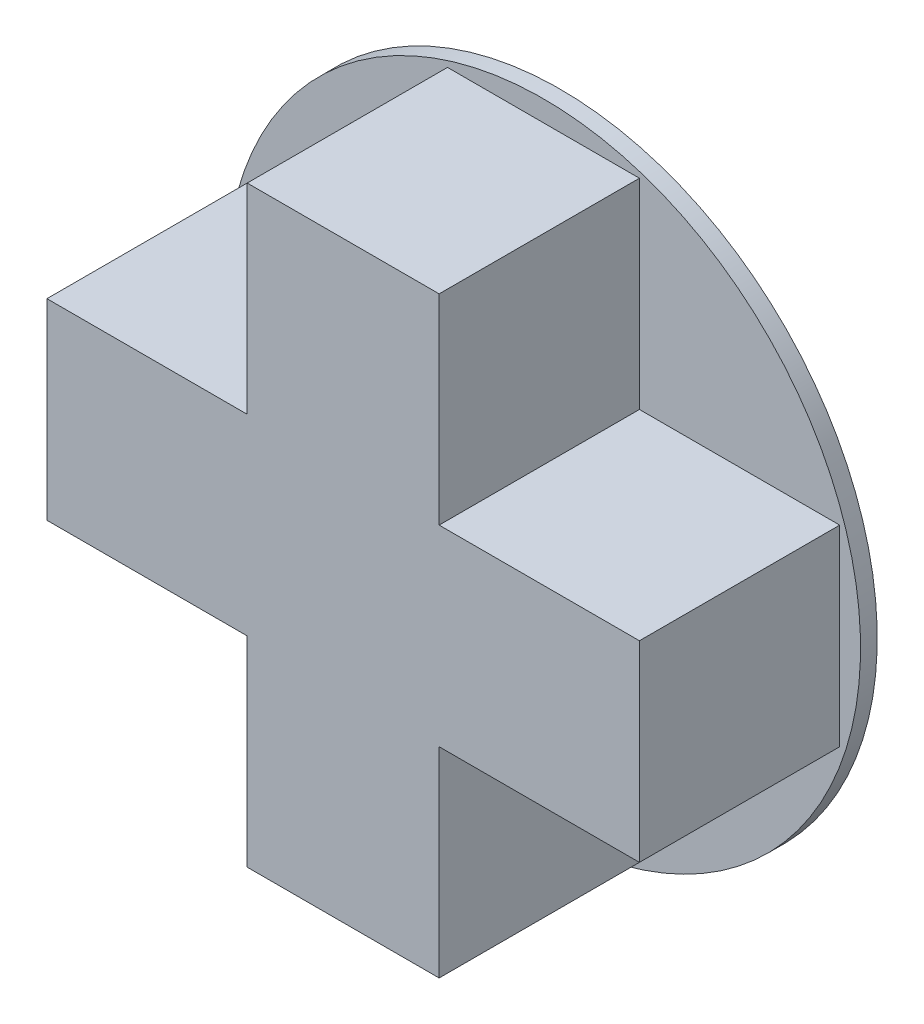
ISO-10303-21;
HEADER;
FILE_DESCRIPTION(('STEP AP214'),'2;1');
FILE_NAME('part.step','',(''),(''),'','','');
FILE_SCHEMA(('AUTOMOTIVE_DESIGN { 1 0 10303 214 1 1 1 1 }'));
ENDSEC;
DATA;
#1=APPLICATION_CONTEXT('core data for automotive mechanical design processes');
#2=APPLICATION_PROTOCOL_DEFINITION('international standard','automotive_design',2000,#1);
#3=PRODUCT_CONTEXT('',#1,'mechanical');
#4=PRODUCT('Part','Part','',(#3));
#5=PRODUCT_RELATED_PRODUCT_CATEGORY('part','',(#4));
#6=PRODUCT_DEFINITION_FORMATION('','',#4);
#7=PRODUCT_DEFINITION_CONTEXT('part definition',#1,'design');
#8=PRODUCT_DEFINITION('design','',#6,#7);
#9=PRODUCT_DEFINITION_SHAPE('','',#8);
#10=(LENGTH_UNIT() NAMED_UNIT(*) SI_UNIT(.MILLI.,.METRE.));
#11=(NAMED_UNIT(*) PLANE_ANGLE_UNIT() SI_UNIT($,.RADIAN.));
#12=(NAMED_UNIT(*) SI_UNIT($,.STERADIAN.) SOLID_ANGLE_UNIT());
#13=UNCERTAINTY_MEASURE_WITH_UNIT(LENGTH_MEASURE(1.E-05),#10,'distance_accuracy_value','');
#14=(GEOMETRIC_REPRESENTATION_CONTEXT(3) GLOBAL_UNCERTAINTY_ASSIGNED_CONTEXT((#13)) GLOBAL_UNIT_ASSIGNED_CONTEXT((#10,
#11,#12)) REPRESENTATION_CONTEXT('',''));
#15=CARTESIAN_POINT('',(0.,0.,0.));
#16=DIRECTION('',(0.,0.,1.));
#17=DIRECTION('',(1.,0.,0.));
#18=AXIS2_PLACEMENT_3D('',#15,#16,#17);
#19=CARTESIAN_POINT('',(2.875,2.875,6.));
#20=DIRECTION('',(-1.,0.,0.));
#21=DIRECTION('',(0.,0.,1.));
#22=AXIS2_PLACEMENT_3D('',#19,#20,#21);
#23=PLANE('',#22);
#24=DIRECTION('',(0.,1.,0.));
#25=VECTOR('',#24,1.);
#26=CARTESIAN_POINT('',(2.875,2.875,0.));
#27=LINE('',#26,#25);
#28=CARTESIAN_POINT('',(2.875,2.875,0.));
#29=VERTEX_POINT('',#28);
#30=CARTESIAN_POINT('',(2.875,8.875,0.));
#31=VERTEX_POINT('',#30);
#32=EDGE_CURVE('E123',#29,#31,#27,.T.);
#33=ORIENTED_EDGE('',*,*,#32,.T.);
#34=DIRECTION('',(0.,0.,-1.));
#35=VECTOR('',#34,1.);
#36=CARTESIAN_POINT('',(2.875,8.875,6.));
#37=LINE('',#36,#35);
#38=CARTESIAN_POINT('',(2.875,8.875,6.));
#39=VERTEX_POINT('',#38);
#40=EDGE_CURVE('E11',#39,#31,#37,.T.);
#41=ORIENTED_EDGE('',*,*,#40,.F.);
#42=DIRECTION('',(0.,1.,0.));
#43=VECTOR('',#42,1.);
#44=CARTESIAN_POINT('',(2.875,2.875,6.));
#45=LINE('',#44,#43);
#46=CARTESIAN_POINT('',(2.875,2.875,6.));
#47=VERTEX_POINT('',#46);
#48=EDGE_CURVE('E127',#47,#39,#45,.T.);
#49=ORIENTED_EDGE('',*,*,#48,.F.);
#50=DIRECTION('',(0.,0.,-1.));
#51=VECTOR('',#50,1.);
#52=CARTESIAN_POINT('',(2.875,2.875,6.));
#53=LINE('',#52,#51);
#54=EDGE_CURVE('E140',#47,#29,#53,.T.);
#55=ORIENTED_EDGE('',*,*,#54,.T.);
#56=EDGE_LOOP('',(#33,#41,#49,#55));
#57=FACE_BOUND('',#56,.T.);
#58=ADVANCED_FACE('F33',(#57),#23,.F.);
#59=CARTESIAN_POINT('',(-2.875,8.875,6.));
#60=DIRECTION('',(0.,-1.,0.));
#61=DIRECTION('',(0.,0.,-1.));
#62=AXIS2_PLACEMENT_3D('',#59,#60,#61);
#63=PLANE('',#62);
#64=DIRECTION('',(-1.,0.,0.));
#65=VECTOR('',#64,1.);
#66=CARTESIAN_POINT('',(-2.875,8.875,0.));
#67=LINE('',#66,#65);
#68=CARTESIAN_POINT('',(-2.875,8.875,0.));
#69=VERTEX_POINT('',#68);
#70=EDGE_CURVE('E178',#31,#69,#67,.T.);
#71=ORIENTED_EDGE('',*,*,#70,.T.);
#72=DIRECTION('',(0.,0.,-1.));
#73=VECTOR('',#72,1.);
#74=CARTESIAN_POINT('',(-2.875,8.875,6.));
#75=LINE('',#74,#73);
#76=CARTESIAN_POINT('',(-2.875,8.875,6.));
#77=VERTEX_POINT('',#76);
#78=EDGE_CURVE('E41',#77,#69,#75,.T.);
#79=ORIENTED_EDGE('',*,*,#78,.F.);
#80=DIRECTION('',(-1.,0.,0.));
#81=VECTOR('',#80,1.);
#82=CARTESIAN_POINT('',(-2.875,8.875,6.));
#83=LINE('',#82,#81);
#84=EDGE_CURVE('E177',#39,#77,#83,.T.);
#85=ORIENTED_EDGE('',*,*,#84,.F.);
#86=ORIENTED_EDGE('',*,*,#40,.T.);
#87=EDGE_LOOP('',(#71,#79,#85,#86));
#88=FACE_BOUND('',#87,.T.);
#89=ADVANCED_FACE('F176',(#88),#63,.F.);
#90=CARTESIAN_POINT('',(-2.875,2.875,6.));
#91=DIRECTION('',(1.,0.,0.));
#92=DIRECTION('',(0.,0.,-1.));
#93=AXIS2_PLACEMENT_3D('',#90,#91,#92);
#94=PLANE('',#93);
#95=DIRECTION('',(0.,-1.,0.));
#96=VECTOR('',#95,1.);
#97=CARTESIAN_POINT('',(-2.875,2.875,0.));
#98=LINE('',#97,#96);
#99=CARTESIAN_POINT('',(-2.875,2.875,0.));
#100=VERTEX_POINT('',#99);
#101=EDGE_CURVE('E172',#69,#100,#98,.T.);
#102=ORIENTED_EDGE('',*,*,#101,.T.);
#103=DIRECTION('',(0.,0.,-1.));
#104=VECTOR('',#103,1.);
#105=CARTESIAN_POINT('',(-2.875,2.875,6.));
#106=LINE('',#105,#104);
#107=CARTESIAN_POINT('',(-2.875,2.875,6.));
#108=VERTEX_POINT('',#107);
#109=EDGE_CURVE('E163',#108,#100,#106,.T.);
#110=ORIENTED_EDGE('',*,*,#109,.F.);
#111=DIRECTION('',(0.,-1.,0.));
#112=VECTOR('',#111,1.);
#113=CARTESIAN_POINT('',(-2.875,2.875,6.));
#114=LINE('',#113,#112);
#115=EDGE_CURVE('E173',#77,#108,#114,.T.);
#116=ORIENTED_EDGE('',*,*,#115,.F.);
#117=ORIENTED_EDGE('',*,*,#78,.T.);
#118=EDGE_LOOP('',(#102,#110,#116,#117));
#119=FACE_BOUND('',#118,.T.);
#120=ADVANCED_FACE('F170',(#119),#94,.F.);
#121=CARTESIAN_POINT('',(-8.875,2.875,6.));
#122=DIRECTION('',(0.,-1.,0.));
#123=DIRECTION('',(1.,0.,0.));
#124=AXIS2_PLACEMENT_3D('',#121,#122,#123);
#125=PLANE('',#124);
#126=DIRECTION('',(-1.,0.,0.));
#127=VECTOR('',#126,1.);
#128=CARTESIAN_POINT('',(-8.875,2.875,0.));
#129=LINE('',#128,#127);
#130=CARTESIAN_POINT('',(-8.875,2.875,0.));
#131=VERTEX_POINT('',#130);
#132=EDGE_CURVE('E181',#100,#131,#129,.T.);
#133=ORIENTED_EDGE('',*,*,#132,.T.);
#134=DIRECTION('',(0.,0.,-1.));
#135=VECTOR('',#134,1.);
#136=CARTESIAN_POINT('',(-8.875,2.875,6.));
#137=LINE('',#136,#135);
#138=CARTESIAN_POINT('',(-8.875,2.875,6.));
#139=VERTEX_POINT('',#138);
#140=EDGE_CURVE('E160',#139,#131,#137,.T.);
#141=ORIENTED_EDGE('',*,*,#140,.F.);
#142=DIRECTION('',(-1.,0.,0.));
#143=VECTOR('',#142,1.);
#144=CARTESIAN_POINT('',(-8.875,2.875,6.));
#145=LINE('',#144,#143);
#146=EDGE_CURVE('E236',#108,#139,#145,.T.);
#147=ORIENTED_EDGE('',*,*,#146,.F.);
#148=ORIENTED_EDGE('',*,*,#109,.T.);
#149=EDGE_LOOP('',(#133,#141,#147,#148));
#150=FACE_BOUND('',#149,.T.);
#151=ADVANCED_FACE('F235',(#150),#125,.F.);
#152=CARTESIAN_POINT('',(-8.875,-2.875,6.));
#153=DIRECTION('',(1.,0.,0.));
#154=DIRECTION('',(0.,0.,-1.));
#155=AXIS2_PLACEMENT_3D('',#152,#153,#154);
#156=PLANE('',#155);
#157=DIRECTION('',(0.,-1.,0.));
#158=VECTOR('',#157,1.);
#159=CARTESIAN_POINT('',(-8.875,-2.875,0.));
#160=LINE('',#159,#158);
#161=CARTESIAN_POINT('',(-8.875,-2.875,0.));
#162=VERTEX_POINT('',#161);
#163=EDGE_CURVE('E189',#131,#162,#160,.T.);
#164=ORIENTED_EDGE('',*,*,#163,.T.);
#165=DIRECTION('',(0.,0.,-1.));
#166=VECTOR('',#165,1.);
#167=CARTESIAN_POINT('',(-8.875,-2.875,6.));
#168=LINE('',#167,#166);
#169=CARTESIAN_POINT('',(-8.875,-2.875,6.));
#170=VERTEX_POINT('',#169);
#171=EDGE_CURVE('E157',#170,#162,#168,.T.);
#172=ORIENTED_EDGE('',*,*,#171,.F.);
#173=DIRECTION('',(0.,-1.,0.));
#174=VECTOR('',#173,1.);
#175=CARTESIAN_POINT('',(-8.875,-2.875,6.));
#176=LINE('',#175,#174);
#177=EDGE_CURVE('E232',#139,#170,#176,.T.);
#178=ORIENTED_EDGE('',*,*,#177,.F.);
#179=ORIENTED_EDGE('',*,*,#140,.T.);
#180=EDGE_LOOP('',(#164,#172,#178,#179));
#181=FACE_BOUND('',#180,.T.);
#182=ADVANCED_FACE('F229',(#181),#156,.F.);
#183=CARTESIAN_POINT('',(-8.875,-2.875,6.));
#184=DIRECTION('',(0.,1.,0.));
#185=DIRECTION('',(0.,0.,1.));
#186=AXIS2_PLACEMENT_3D('',#183,#184,#185);
#187=PLANE('',#186);
#188=DIRECTION('',(1.,0.,0.));
#189=VECTOR('',#188,1.);
#190=CARTESIAN_POINT('',(-8.875,-2.875,0.));
#191=LINE('',#190,#189);
#192=CARTESIAN_POINT('',(-2.875,-2.875,0.));
#193=VERTEX_POINT('',#192);
#194=EDGE_CURVE('E192',#162,#193,#191,.T.);
#195=ORIENTED_EDGE('',*,*,#194,.T.);
#196=DIRECTION('',(0.,0.,-1.));
#197=VECTOR('',#196,1.);
#198=CARTESIAN_POINT('',(-2.875,-2.875,6.));
#199=LINE('',#198,#197);
#200=CARTESIAN_POINT('',(-2.875,-2.875,6.));
#201=VERTEX_POINT('',#200);
#202=EDGE_CURVE('E154',#201,#193,#199,.T.);
#203=ORIENTED_EDGE('',*,*,#202,.F.);
#204=DIRECTION('',(1.,0.,0.));
#205=VECTOR('',#204,1.);
#206=CARTESIAN_POINT('',(-8.875,-2.875,6.));
#207=LINE('',#206,#205);
#208=EDGE_CURVE('E226',#170,#201,#207,.T.);
#209=ORIENTED_EDGE('',*,*,#208,.F.);
#210=ORIENTED_EDGE('',*,*,#171,.T.);
#211=EDGE_LOOP('',(#195,#203,#209,#210));
#212=FACE_BOUND('',#211,.T.);
#213=ADVANCED_FACE('F225',(#212),#187,.F.);
#214=CARTESIAN_POINT('',(-2.875,-8.875,6.));
#215=DIRECTION('',(1.,0.,0.));
#216=DIRECTION('',(0.,0.,-1.));
#217=AXIS2_PLACEMENT_3D('',#214,#215,#216);
#218=PLANE('',#217);
#219=DIRECTION('',(0.,-1.,0.));
#220=VECTOR('',#219,1.);
#221=CARTESIAN_POINT('',(-2.875,-8.875,0.));
#222=LINE('',#221,#220);
#223=CARTESIAN_POINT('',(-2.875,-8.875,0.));
#224=VERTEX_POINT('',#223);
#225=EDGE_CURVE('E195',#193,#224,#222,.T.);
#226=ORIENTED_EDGE('',*,*,#225,.T.);
#227=DIRECTION('',(0.,0.,-1.));
#228=VECTOR('',#227,1.);
#229=CARTESIAN_POINT('',(-2.875,-8.875,6.));
#230=LINE('',#229,#228);
#231=CARTESIAN_POINT('',(-2.875,-8.875,6.));
#232=VERTEX_POINT('',#231);
#233=EDGE_CURVE('E151',#232,#224,#230,.T.);
#234=ORIENTED_EDGE('',*,*,#233,.F.);
#235=DIRECTION('',(0.,-1.,0.));
#236=VECTOR('',#235,1.);
#237=CARTESIAN_POINT('',(-2.875,-8.875,6.));
#238=LINE('',#237,#236);
#239=EDGE_CURVE('E222',#201,#232,#238,.T.);
#240=ORIENTED_EDGE('',*,*,#239,.F.);
#241=ORIENTED_EDGE('',*,*,#202,.T.);
#242=EDGE_LOOP('',(#226,#234,#240,#241));
#243=FACE_BOUND('',#242,.T.);
#244=ADVANCED_FACE('F219',(#243),#218,.F.);
#245=CARTESIAN_POINT('',(-2.875,-8.875,6.));
#246=DIRECTION('',(0.,1.,0.));
#247=DIRECTION('',(0.,0.,1.));
#248=AXIS2_PLACEMENT_3D('',#245,#246,#247);
#249=PLANE('',#248);
#250=DIRECTION('',(1.,0.,0.));
#251=VECTOR('',#250,1.);
#252=CARTESIAN_POINT('',(-2.875,-8.875,0.));
#253=LINE('',#252,#251);
#254=CARTESIAN_POINT('',(2.875,-8.875,0.));
#255=VERTEX_POINT('',#254);
#256=EDGE_CURVE('E198',#224,#255,#253,.T.);
#257=ORIENTED_EDGE('',*,*,#256,.T.);
#258=DIRECTION('',(0.,0.,-1.));
#259=VECTOR('',#258,1.);
#260=CARTESIAN_POINT('',(2.875,-8.875,6.));
#261=LINE('',#260,#259);
#262=CARTESIAN_POINT('',(2.875,-8.875,6.));
#263=VERTEX_POINT('',#262);
#264=EDGE_CURVE('E148',#263,#255,#261,.T.);
#265=ORIENTED_EDGE('',*,*,#264,.F.);
#266=DIRECTION('',(1.,0.,0.));
#267=VECTOR('',#266,1.);
#268=CARTESIAN_POINT('',(-2.875,-8.875,6.));
#269=LINE('',#268,#267);
#270=EDGE_CURVE('E216',#232,#263,#269,.T.);
#271=ORIENTED_EDGE('',*,*,#270,.F.);
#272=ORIENTED_EDGE('',*,*,#233,.T.);
#273=EDGE_LOOP('',(#257,#265,#271,#272));
#274=FACE_BOUND('',#273,.T.);
#275=ADVANCED_FACE('F215',(#274),#249,.F.);
#276=CARTESIAN_POINT('',(2.875,-8.875,6.));
#277=DIRECTION('',(-1.,0.,0.));
#278=DIRECTION('',(0.,-1.,0.));
#279=AXIS2_PLACEMENT_3D('',#276,#277,#278);
#280=PLANE('',#279);
#281=DIRECTION('',(0.,1.,0.));
#282=VECTOR('',#281,1.);
#283=CARTESIAN_POINT('',(2.875,-8.875,0.));
#284=LINE('',#283,#282);
#285=CARTESIAN_POINT('',(2.875,-2.875,0.));
#286=VERTEX_POINT('',#285);
#287=EDGE_CURVE('E201',#255,#286,#284,.T.);
#288=ORIENTED_EDGE('',*,*,#287,.T.);
#289=DIRECTION('',(0.,0.,-1.));
#290=VECTOR('',#289,1.);
#291=CARTESIAN_POINT('',(2.875,-2.875,6.));
#292=LINE('',#291,#290);
#293=CARTESIAN_POINT('',(2.875,-2.875,6.));
#294=VERTEX_POINT('',#293);
#295=EDGE_CURVE('E142',#294,#286,#292,.T.);
#296=ORIENTED_EDGE('',*,*,#295,.F.);
#297=DIRECTION('',(0.,1.,0.));
#298=VECTOR('',#297,1.);
#299=CARTESIAN_POINT('',(2.875,-8.875,6.));
#300=LINE('',#299,#298);
#301=EDGE_CURVE('E212',#263,#294,#300,.T.);
#302=ORIENTED_EDGE('',*,*,#301,.F.);
#303=ORIENTED_EDGE('',*,*,#264,.T.);
#304=EDGE_LOOP('',(#288,#296,#302,#303));
#305=FACE_BOUND('',#304,.T.);
#306=ADVANCED_FACE('F209',(#305),#280,.F.);
#307=CARTESIAN_POINT('',(2.875,-2.875,6.));
#308=DIRECTION('',(0.,1.,0.));
#309=DIRECTION('',(0.,0.,1.));
#310=AXIS2_PLACEMENT_3D('',#307,#308,#309);
#311=PLANE('',#310);
#312=DIRECTION('',(1.,0.,0.));
#313=VECTOR('',#312,1.);
#314=CARTESIAN_POINT('',(2.875,-2.875,0.));
#315=LINE('',#314,#313);
#316=CARTESIAN_POINT('',(8.875,-2.875,0.));
#317=VERTEX_POINT('',#316);
#318=EDGE_CURVE('E137',#286,#317,#315,.T.);
#319=ORIENTED_EDGE('',*,*,#318,.T.);
#320=DIRECTION('',(0.,0.,-1.));
#321=VECTOR('',#320,1.);
#322=CARTESIAN_POINT('',(8.875,-2.875,6.));
#323=LINE('',#322,#321);
#324=CARTESIAN_POINT('',(8.875,-2.875,6.));
#325=VERTEX_POINT('',#324);
#326=EDGE_CURVE('E136',#325,#317,#323,.T.);
#327=ORIENTED_EDGE('',*,*,#326,.F.);
#328=DIRECTION('',(1.,0.,0.));
#329=VECTOR('',#328,1.);
#330=CARTESIAN_POINT('',(2.875,-2.875,6.));
#331=LINE('',#330,#329);
#332=EDGE_CURVE('E246',#294,#325,#331,.T.);
#333=ORIENTED_EDGE('',*,*,#332,.F.);
#334=ORIENTED_EDGE('',*,*,#295,.T.);
#335=EDGE_LOOP('',(#319,#327,#333,#334));
#336=FACE_BOUND('',#335,.T.);
#337=ADVANCED_FACE('F205',(#336),#311,.F.);
#338=CARTESIAN_POINT('',(8.875,-2.875,6.));
#339=DIRECTION('',(-1.,0.,0.));
#340=DIRECTION('',(0.,0.,1.));
#341=AXIS2_PLACEMENT_3D('',#338,#339,#340);
#342=PLANE('',#341);
#343=DIRECTION('',(0.,1.,0.));
#344=VECTOR('',#343,1.);
#345=CARTESIAN_POINT('',(8.875,-2.875,0.));
#346=LINE('',#345,#344);
#347=CARTESIAN_POINT('',(8.875,2.875,0.));
#348=VERTEX_POINT('',#347);
#349=EDGE_CURVE('E120',#317,#348,#346,.T.);
#350=ORIENTED_EDGE('',*,*,#349,.T.);
#351=DIRECTION('',(0.,0.,-1.));
#352=VECTOR('',#351,1.);
#353=CARTESIAN_POINT('',(8.875,2.875,6.));
#354=LINE('',#353,#352);
#355=CARTESIAN_POINT('',(8.875,2.875,6.));
#356=VERTEX_POINT('',#355);
#357=EDGE_CURVE('E134',#356,#348,#354,.T.);
#358=ORIENTED_EDGE('',*,*,#357,.F.);
#359=DIRECTION('',(0.,1.,0.));
#360=VECTOR('',#359,1.);
#361=CARTESIAN_POINT('',(8.875,-2.875,6.));
#362=LINE('',#361,#360);
#363=EDGE_CURVE('E248',#325,#356,#362,.T.);
#364=ORIENTED_EDGE('',*,*,#363,.F.);
#365=ORIENTED_EDGE('',*,*,#326,.T.);
#366=EDGE_LOOP('',(#350,#358,#364,#365));
#367=FACE_BOUND('',#366,.T.);
#368=ADVANCED_FACE('F132',(#367),#342,.F.);
#369=CARTESIAN_POINT('',(2.875,2.875,6.));
#370=DIRECTION('',(0.,-1.,0.));
#371=DIRECTION('',(0.,0.,-1.));
#372=AXIS2_PLACEMENT_3D('',#369,#370,#371);
#373=PLANE('',#372);
#374=DIRECTION('',(-1.,0.,0.));
#375=VECTOR('',#374,1.);
#376=CARTESIAN_POINT('',(2.875,2.875,0.));
#377=LINE('',#376,#375);
#378=EDGE_CURVE('E117',#348,#29,#377,.T.);
#379=ORIENTED_EDGE('',*,*,#378,.T.);
#380=ORIENTED_EDGE('',*,*,#54,.F.);
#381=DIRECTION('',(-1.,0.,0.));
#382=VECTOR('',#381,1.);
#383=CARTESIAN_POINT('',(2.875,2.875,6.));
#384=LINE('',#383,#382);
#385=EDGE_CURVE('E48',#356,#47,#384,.T.);
#386=ORIENTED_EDGE('',*,*,#385,.F.);
#387=ORIENTED_EDGE('',*,*,#357,.T.);
#388=EDGE_LOOP('',(#379,#380,#386,#387));
#389=FACE_BOUND('',#388,.T.);
#390=ADVANCED_FACE('F139',(#389),#373,.F.);
#391=CARTESIAN_POINT('',(0.,0.,6.));
#392=DIRECTION('',(0.,0.,-1.));
#393=DIRECTION('',(-1.,0.,0.));
#394=AXIS2_PLACEMENT_3D('',#391,#392,#393);
#395=PLANE('',#394);
#396=ORIENTED_EDGE('',*,*,#48,.T.);
#397=ORIENTED_EDGE('',*,*,#84,.T.);
#398=ORIENTED_EDGE('',*,*,#115,.T.);
#399=ORIENTED_EDGE('',*,*,#146,.T.);
#400=ORIENTED_EDGE('',*,*,#177,.T.);
#401=ORIENTED_EDGE('',*,*,#208,.T.);
#402=ORIENTED_EDGE('',*,*,#239,.T.);
#403=ORIENTED_EDGE('',*,*,#270,.T.);
#404=ORIENTED_EDGE('',*,*,#301,.T.);
#405=ORIENTED_EDGE('',*,*,#332,.T.);
#406=ORIENTED_EDGE('',*,*,#363,.T.);
#407=ORIENTED_EDGE('',*,*,#385,.T.);
#408=EDGE_LOOP('',(#396,#397,#398,#399,#400,#401,#402,#403,#404,#405,#406,#407));
#409=FACE_BOUND('',#408,.T.);
#410=ADVANCED_FACE('F249',(#409),#395,.F.);
#411=CARTESIAN_POINT('',(0.,0.,0.));
#412=DIRECTION('',(0.,0.,-1.));
#413=DIRECTION('',(-1.,0.,0.));
#414=AXIS2_PLACEMENT_3D('',#411,#412,#413);
#415=PLANE('',#414);
#416=CARTESIAN_POINT('',(0.,0.,0.));
#417=DIRECTION('',(0.,0.,-1.));
#418=DIRECTION('',(-1.,0.,0.));
#419=AXIS2_PLACEMENT_3D('',#416,#417,#418);
#420=CIRCLE('',#419,9.5);
#421=CARTESIAN_POINT('',(-9.5,0.,0.));
#422=VERTEX_POINT('',#421);
#423=EDGE_CURVE('E269',#422,#422,#420,.T.);
#424=ORIENTED_EDGE('',*,*,#423,.F.);
#425=EDGE_LOOP('',(#424));
#426=FACE_BOUND('',#425,.T.);
#427=ORIENTED_EDGE('',*,*,#70,.F.);
#428=ORIENTED_EDGE('',*,*,#32,.F.);
#429=ORIENTED_EDGE('',*,*,#378,.F.);
#430=ORIENTED_EDGE('',*,*,#349,.F.);
#431=ORIENTED_EDGE('',*,*,#318,.F.);
#432=ORIENTED_EDGE('',*,*,#287,.F.);
#433=ORIENTED_EDGE('',*,*,#256,.F.);
#434=ORIENTED_EDGE('',*,*,#225,.F.);
#435=ORIENTED_EDGE('',*,*,#194,.F.);
#436=ORIENTED_EDGE('',*,*,#163,.F.);
#437=ORIENTED_EDGE('',*,*,#132,.F.);
#438=ORIENTED_EDGE('',*,*,#101,.F.);
#439=EDGE_LOOP('',(#427,#428,#429,#430,#431,#432,#433,#434,#435,#436,#437,#438));
#440=FACE_BOUND('',#439,.T.);
#441=ADVANCED_FACE('F119',(#426,#440),#415,.F.);
#442=CARTESIAN_POINT('',(0.,0.,-0.5));
#443=DIRECTION('',(0.,0.,1.));
#444=DIRECTION('',(1.,0.,0.));
#445=AXIS2_PLACEMENT_3D('',#442,#443,#444);
#446=CYLINDRICAL_SURFACE('',#445,9.5);
#447=CARTESIAN_POINT('',(0.,0.,-0.5));
#448=DIRECTION('',(0.,0.,-1.));
#449=DIRECTION('',(-1.,0.,0.));
#450=AXIS2_PLACEMENT_3D('',#447,#448,#449);
#451=CIRCLE('',#450,9.5);
#452=CARTESIAN_POINT('',(-9.5,0.,-0.5));
#453=VERTEX_POINT('',#452);
#454=EDGE_CURVE('E183',#453,#453,#451,.T.);
#455=ORIENTED_EDGE('',*,*,#454,.F.);
#456=EDGE_LOOP('',(#455));
#457=FACE_BOUND('',#456,.T.);
#458=ORIENTED_EDGE('',*,*,#423,.T.);
#459=EDGE_LOOP('',(#458));
#460=FACE_BOUND('',#459,.T.);
#461=ADVANCED_FACE('F257',(#457,#460),#446,.T.);
#462=CARTESIAN_POINT('',(0.,0.,-0.5));
#463=DIRECTION('',(0.,0.,-1.));
#464=DIRECTION('',(-1.,0.,0.));
#465=AXIS2_PLACEMENT_3D('',#462,#463,#464);
#466=PLANE('',#465);
#467=CARTESIAN_POINT('',(0.,6.,-0.5));
#468=DIRECTION('',(0.,0.,-1.));
#469=DIRECTION('',(-1.,0.,0.));
#470=AXIS2_PLACEMENT_3D('',#467,#468,#469);
#471=CIRCLE('',#470,1.74999999999998);
#472=CARTESIAN_POINT('',(-1.74999999999998,6.,-0.5));
#473=VERTEX_POINT('',#472);
#474=EDGE_CURVE('E293',#473,#473,#471,.T.);
#475=ORIENTED_EDGE('',*,*,#474,.F.);
#476=EDGE_LOOP('',(#475));
#477=FACE_BOUND('',#476,.T.);
#478=CARTESIAN_POINT('',(6.,0.,-0.5));
#479=DIRECTION('',(0.,0.,-1.));
#480=DIRECTION('',(-1.,0.,0.));
#481=AXIS2_PLACEMENT_3D('',#478,#479,#480);
#482=CIRCLE('',#481,1.75);
#483=CARTESIAN_POINT('',(4.25,0.,-0.5));
#484=VERTEX_POINT('',#483);
#485=EDGE_CURVE('E287',#484,#484,#482,.T.);
#486=ORIENTED_EDGE('',*,*,#485,.F.);
#487=EDGE_LOOP('',(#486));
#488=FACE_BOUND('',#487,.T.);
#489=CARTESIAN_POINT('',(0.,-6.,-0.5));
#490=DIRECTION('',(0.,0.,-1.));
#491=DIRECTION('',(-1.,0.,0.));
#492=AXIS2_PLACEMENT_3D('',#489,#490,#491);
#493=CIRCLE('',#492,1.74999999999999);
#494=CARTESIAN_POINT('',(-1.74999999999999,-6.,-0.5));
#495=VERTEX_POINT('',#494);
#496=EDGE_CURVE('E281',#495,#495,#493,.T.);
#497=ORIENTED_EDGE('',*,*,#496,.F.);
#498=EDGE_LOOP('',(#497));
#499=FACE_BOUND('',#498,.T.);
#500=CARTESIAN_POINT('',(-6.,0.,-0.5));
#501=DIRECTION('',(0.,0.,-1.));
#502=DIRECTION('',(-1.,0.,0.));
#503=AXIS2_PLACEMENT_3D('',#500,#501,#502);
#504=CIRCLE('',#503,1.75);
#505=CARTESIAN_POINT('',(-7.75,0.,-0.5));
#506=VERTEX_POINT('',#505);
#507=EDGE_CURVE('E275',#506,#506,#504,.T.);
#508=ORIENTED_EDGE('',*,*,#507,.F.);
#509=EDGE_LOOP('',(#508));
#510=FACE_BOUND('',#509,.T.);
#511=ORIENTED_EDGE('',*,*,#454,.T.);
#512=EDGE_LOOP('',(#511));
#513=FACE_BOUND('',#512,.T.);
#514=ADVANCED_FACE('F308',(#477,#488,#499,#510,#513),#466,.T.);
#515=CARTESIAN_POINT('',(-6.,0.,0.25));
#516=DIRECTION('',(0.,0.,-1.));
#517=DIRECTION('',(-1.,0.,0.));
#518=AXIS2_PLACEMENT_3D('',#515,#516,#517);
#519=CYLINDRICAL_SURFACE('',#518,1.75);
#520=CARTESIAN_POINT('',(-6.,0.,0.25));
#521=DIRECTION('',(0.,0.,-1.));
#522=DIRECTION('',(-1.,0.,0.));
#523=AXIS2_PLACEMENT_3D('',#520,#521,#522);
#524=CIRCLE('',#523,1.75);
#525=CARTESIAN_POINT('',(-7.75,0.,0.25));
#526=VERTEX_POINT('',#525);
#527=EDGE_CURVE('E272',#526,#526,#524,.T.);
#528=ORIENTED_EDGE('',*,*,#527,.F.);
#529=EDGE_LOOP('',(#528));
#530=FACE_BOUND('',#529,.T.);
#531=ORIENTED_EDGE('',*,*,#507,.T.);
#532=EDGE_LOOP('',(#531));
#533=FACE_BOUND('',#532,.T.);
#534=ADVANCED_FACE('F311',(#530,#533),#519,.F.);
#535=CARTESIAN_POINT('',(-6.,0.,0.25));
#536=DIRECTION('',(0.,0.,-1.));
#537=DIRECTION('',(-1.,0.,0.));
#538=AXIS2_PLACEMENT_3D('',#535,#536,#537);
#539=PLANE('',#538);
#540=ORIENTED_EDGE('',*,*,#527,.T.);
#541=EDGE_LOOP('',(#540));
#542=FACE_BOUND('',#541,.T.);
#543=ADVANCED_FACE('F329',(#542),#539,.T.);
#544=CARTESIAN_POINT('',(0.,-6.,0.25));
#545=DIRECTION('',(0.,0.,-1.));
#546=DIRECTION('',(-1.,0.,0.));
#547=AXIS2_PLACEMENT_3D('',#544,#545,#546);
#548=CYLINDRICAL_SURFACE('',#547,1.74999999999999);
#549=CARTESIAN_POINT('',(0.,-6.,0.25));
#550=DIRECTION('',(0.,0.,-1.));
#551=DIRECTION('',(-1.,0.,0.));
#552=AXIS2_PLACEMENT_3D('',#549,#550,#551);
#553=CIRCLE('',#552,1.74999999999999);
#554=CARTESIAN_POINT('',(-1.74999999999999,-6.,0.25));
#555=VERTEX_POINT('',#554);
#556=EDGE_CURVE('E278',#555,#555,#553,.T.);
#557=ORIENTED_EDGE('',*,*,#556,.F.);
#558=EDGE_LOOP('',(#557));
#559=FACE_BOUND('',#558,.T.);
#560=ORIENTED_EDGE('',*,*,#496,.T.);
#561=EDGE_LOOP('',(#560));
#562=FACE_BOUND('',#561,.T.);
#563=ADVANCED_FACE('F333',(#559,#562),#548,.F.);
#564=CARTESIAN_POINT('',(0.,-6.,0.25));
#565=DIRECTION('',(0.,0.,-1.));
#566=DIRECTION('',(-1.,0.,0.));
#567=AXIS2_PLACEMENT_3D('',#564,#565,#566);
#568=PLANE('',#567);
#569=ORIENTED_EDGE('',*,*,#556,.T.);
#570=EDGE_LOOP('',(#569));
#571=FACE_BOUND('',#570,.T.);
#572=ADVANCED_FACE('F337',(#571),#568,.T.);
#573=CARTESIAN_POINT('',(6.,0.,0.25));
#574=DIRECTION('',(0.,0.,-1.));
#575=DIRECTION('',(-1.,0.,0.));
#576=AXIS2_PLACEMENT_3D('',#573,#574,#575);
#577=CYLINDRICAL_SURFACE('',#576,1.75);
#578=CARTESIAN_POINT('',(6.,0.,0.25));
#579=DIRECTION('',(0.,0.,-1.));
#580=DIRECTION('',(-1.,0.,0.));
#581=AXIS2_PLACEMENT_3D('',#578,#579,#580);
#582=CIRCLE('',#581,1.75);
#583=CARTESIAN_POINT('',(4.25,0.,0.25));
#584=VERTEX_POINT('',#583);
#585=EDGE_CURVE('E284',#584,#584,#582,.T.);
#586=ORIENTED_EDGE('',*,*,#585,.F.);
#587=EDGE_LOOP('',(#586));
#588=FACE_BOUND('',#587,.T.);
#589=ORIENTED_EDGE('',*,*,#485,.T.);
#590=EDGE_LOOP('',(#589));
#591=FACE_BOUND('',#590,.T.);
#592=ADVANCED_FACE('F341',(#588,#591),#577,.F.);
#593=CARTESIAN_POINT('',(6.,0.,0.25));
#594=DIRECTION('',(0.,0.,-1.));
#595=DIRECTION('',(-1.,0.,0.));
#596=AXIS2_PLACEMENT_3D('',#593,#594,#595);
#597=PLANE('',#596);
#598=ORIENTED_EDGE('',*,*,#585,.T.);
#599=EDGE_LOOP('',(#598));
#600=FACE_BOUND('',#599,.T.);
#601=ADVANCED_FACE('F304',(#600),#597,.T.);
#602=CARTESIAN_POINT('',(0.,6.,0.25));
#603=DIRECTION('',(0.,0.,-1.));
#604=DIRECTION('',(-1.,0.,0.));
#605=AXIS2_PLACEMENT_3D('',#602,#603,#604);
#606=CYLINDRICAL_SURFACE('',#605,1.74999999999998);
#607=CARTESIAN_POINT('',(0.,6.,0.25));
#608=DIRECTION('',(0.,0.,-1.));
#609=DIRECTION('',(-1.,0.,0.));
#610=AXIS2_PLACEMENT_3D('',#607,#608,#609);
#611=CIRCLE('',#610,1.74999999999998);
#612=CARTESIAN_POINT('',(-1.74999999999998,6.,0.25));
#613=VERTEX_POINT('',#612);
#614=EDGE_CURVE('E290',#613,#613,#611,.T.);
#615=ORIENTED_EDGE('',*,*,#614,.F.);
#616=EDGE_LOOP('',(#615));
#617=FACE_BOUND('',#616,.T.);
#618=ORIENTED_EDGE('',*,*,#474,.T.);
#619=EDGE_LOOP('',(#618));
#620=FACE_BOUND('',#619,.T.);
#621=ADVANCED_FACE('F301',(#617,#620),#606,.F.);
#622=CARTESIAN_POINT('',(0.,6.,0.25));
#623=DIRECTION('',(0.,0.,-1.));
#624=DIRECTION('',(-1.,0.,0.));
#625=AXIS2_PLACEMENT_3D('',#622,#623,#624);
#626=PLANE('',#625);
#627=ORIENTED_EDGE('',*,*,#614,.T.);
#628=EDGE_LOOP('',(#627));
#629=FACE_BOUND('',#628,.T.);
#630=ADVANCED_FACE('F299',(#629),#626,.T.);
#631=CLOSED_SHELL('',(#58,#89,#120,#151,#182,#213,#244,#275,#306,#337,#368,#390,#410,#441,#461,
#514,#534,#543,#563,#572,#592,#601,#621,#630));
#632=MANIFOLD_SOLID_BREP('B2',#631);
#633=ADVANCED_BREP_SHAPE_REPRESENTATION('',(#18,#632),#14);
#634=SHAPE_DEFINITION_REPRESENTATION(#9,#633);
ENDSEC;
END-ISO-10303-21;
